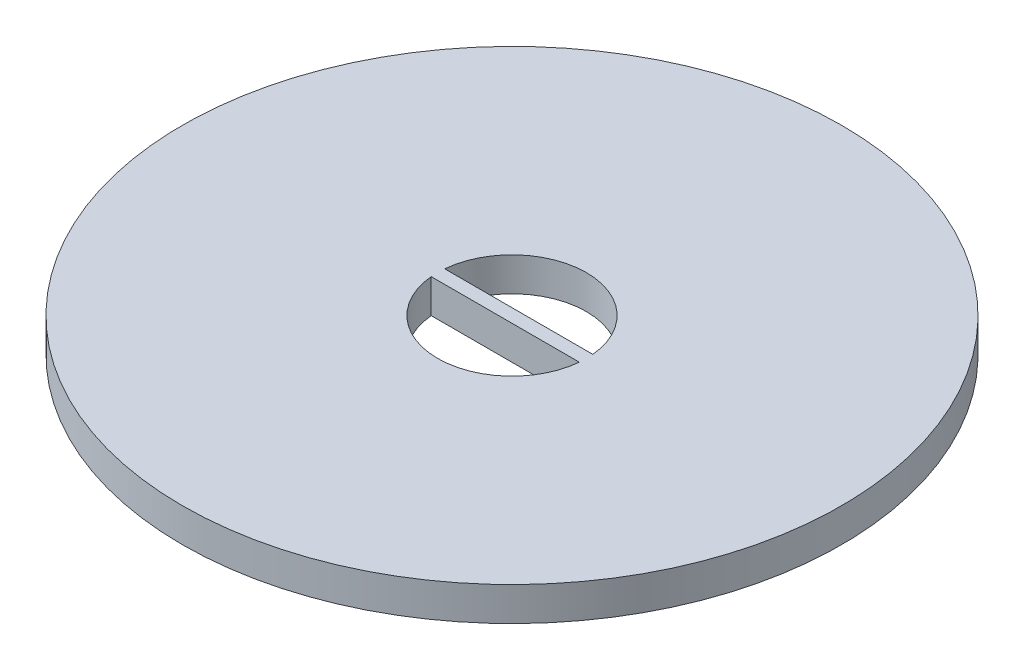
ISO-10303-21;
HEADER;
FILE_DESCRIPTION(('STEP AP214'),'2;1');
FILE_NAME('part.step','',(''),(''),'','','');
FILE_SCHEMA(('AUTOMOTIVE_DESIGN { 1 0 10303 214 1 1 1 1 }'));
ENDSEC;
DATA;
#1=APPLICATION_CONTEXT('core data for automotive mechanical design processes');
#2=APPLICATION_PROTOCOL_DEFINITION('international standard','automotive_design',2000,#1);
#3=PRODUCT_CONTEXT('',#1,'mechanical');
#4=PRODUCT('Part','Part','',(#3));
#5=PRODUCT_RELATED_PRODUCT_CATEGORY('part','',(#4));
#6=PRODUCT_DEFINITION_FORMATION('','',#4);
#7=PRODUCT_DEFINITION_CONTEXT('part definition',#1,'design');
#8=PRODUCT_DEFINITION('design','',#6,#7);
#9=PRODUCT_DEFINITION_SHAPE('','',#8);
#10=(LENGTH_UNIT() NAMED_UNIT(*) SI_UNIT(.MILLI.,.METRE.));
#11=(NAMED_UNIT(*) PLANE_ANGLE_UNIT() SI_UNIT($,.RADIAN.));
#12=(NAMED_UNIT(*) SI_UNIT($,.STERADIAN.) SOLID_ANGLE_UNIT());
#13=UNCERTAINTY_MEASURE_WITH_UNIT(LENGTH_MEASURE(1.E-05),#10,'distance_accuracy_value','');
#14=(GEOMETRIC_REPRESENTATION_CONTEXT(3) GLOBAL_UNCERTAINTY_ASSIGNED_CONTEXT((#13)) GLOBAL_UNIT_ASSIGNED_CONTEXT((#10,
#11,#12)) REPRESENTATION_CONTEXT('',''));
#15=CARTESIAN_POINT('',(0.,0.,0.));
#16=DIRECTION('',(0.,0.,1.));
#17=DIRECTION('',(1.,0.,0.));
#18=AXIS2_PLACEMENT_3D('',#15,#16,#17);
#19=CARTESIAN_POINT('',(0.,1.,0.));
#20=DIRECTION('',(0.,1.,0.));
#21=DIRECTION('',(0.,0.,1.));
#22=AXIS2_PLACEMENT_3D('',#19,#20,#21);
#23=PLANE('',#22);
#24=DIRECTION('',(1.,0.,0.));
#25=VECTOR('',#24,1.);
#26=CARTESIAN_POINT('',(0.,1.,-0.2));
#27=LINE('',#26,#25);
#28=CARTESIAN_POINT('',(-2.19089023002066,1.,-0.2));
#29=VERTEX_POINT('',#28);
#30=CARTESIAN_POINT('',(2.19089023002066,1.,-0.2));
#31=VERTEX_POINT('',#30);
#32=EDGE_CURVE('E61',#29,#31,#27,.T.);
#33=ORIENTED_EDGE('',*,*,#32,.F.);
#34=CARTESIAN_POINT('',(0.,1.,0.));
#35=DIRECTION('',(0.,1.,0.));
#36=DIRECTION('',(0.,0.,1.));
#37=AXIS2_PLACEMENT_3D('',#34,#35,#36);
#38=CIRCLE('',#37,2.2);
#39=EDGE_CURVE('E97',#31,#29,#38,.T.);
#40=ORIENTED_EDGE('',*,*,#39,.F.);
#41=EDGE_LOOP('',(#33,#40));
#42=FACE_BOUND('',#41,.T.);
#43=CARTESIAN_POINT('',(0.,1.,0.));
#44=DIRECTION('',(0.,1.,0.));
#45=DIRECTION('',(0.,0.,1.));
#46=AXIS2_PLACEMENT_3D('',#43,#44,#45);
#47=CIRCLE('',#46,9.75);
#48=CARTESIAN_POINT('',(0.,1.,9.75));
#49=VERTEX_POINT('',#48);
#50=EDGE_CURVE('E120',#49,#49,#47,.T.);
#51=ORIENTED_EDGE('',*,*,#50,.T.);
#52=EDGE_LOOP('',(#51));
#53=FACE_BOUND('',#52,.T.);
#54=CARTESIAN_POINT('',(0.,1.,0.));
#55=DIRECTION('',(0.,1.,0.));
#56=DIRECTION('',(0.,0.,1.));
#57=AXIS2_PLACEMENT_3D('',#54,#55,#56);
#58=CIRCLE('',#57,2.2);
#59=CARTESIAN_POINT('',(-2.19089023002066,1.,0.2));
#60=VERTEX_POINT('',#59);
#61=CARTESIAN_POINT('',(2.19089023002066,1.,0.2));
#62=VERTEX_POINT('',#61);
#63=EDGE_CURVE('E114',#60,#62,#58,.T.);
#64=ORIENTED_EDGE('',*,*,#63,.F.);
#65=DIRECTION('',(1.,0.,0.));
#66=VECTOR('',#65,1.);
#67=CARTESIAN_POINT('',(0.,1.,0.2));
#68=LINE('',#67,#66);
#69=EDGE_CURVE('E69',#60,#62,#68,.T.);
#70=ORIENTED_EDGE('',*,*,#69,.T.);
#71=EDGE_LOOP('',(#64,#70));
#72=FACE_BOUND('',#71,.T.);
#73=ADVANCED_FACE('F45',(#42,#53,#72),#23,.T.);
#74=CARTESIAN_POINT('',(0.,0.,0.));
#75=DIRECTION('',(0.,1.,0.));
#76=DIRECTION('',(0.,0.,1.));
#77=AXIS2_PLACEMENT_3D('',#74,#75,#76);
#78=PLANE('',#77);
#79=CARTESIAN_POINT('',(0.,0.,0.));
#80=DIRECTION('',(0.,1.,0.));
#81=DIRECTION('',(0.,0.,1.));
#82=AXIS2_PLACEMENT_3D('',#79,#80,#81);
#83=CIRCLE('',#82,2.2);
#84=CARTESIAN_POINT('',(2.19089023002066,0.,-0.2));
#85=VERTEX_POINT('',#84);
#86=CARTESIAN_POINT('',(-2.19089023002066,0.,-0.2));
#87=VERTEX_POINT('',#86);
#88=EDGE_CURVE('E54',#85,#87,#83,.T.);
#89=ORIENTED_EDGE('',*,*,#88,.T.);
#90=DIRECTION('',(1.,0.,0.));
#91=VECTOR('',#90,1.);
#92=CARTESIAN_POINT('',(0.,0.,-0.2));
#93=LINE('',#92,#91);
#94=EDGE_CURVE('E11',#87,#85,#93,.T.);
#95=ORIENTED_EDGE('',*,*,#94,.T.);
#96=EDGE_LOOP('',(#89,#95));
#97=FACE_BOUND('',#96,.T.);
#98=CARTESIAN_POINT('',(0.,0.,0.));
#99=DIRECTION('',(0.,1.,0.));
#100=DIRECTION('',(0.,0.,1.));
#101=AXIS2_PLACEMENT_3D('',#98,#99,#100);
#102=CIRCLE('',#101,9.75);
#103=CARTESIAN_POINT('',(0.,0.,9.75));
#104=VERTEX_POINT('',#103);
#105=EDGE_CURVE('E93',#104,#104,#102,.T.);
#106=ORIENTED_EDGE('',*,*,#105,.F.);
#107=EDGE_LOOP('',(#106));
#108=FACE_BOUND('',#107,.T.);
#109=DIRECTION('',(1.,0.,0.));
#110=VECTOR('',#109,1.);
#111=CARTESIAN_POINT('',(0.,0.,0.2));
#112=LINE('',#111,#110);
#113=CARTESIAN_POINT('',(-2.19089023002066,0.,0.2));
#114=VERTEX_POINT('',#113);
#115=CARTESIAN_POINT('',(2.19089023002066,0.,0.2));
#116=VERTEX_POINT('',#115);
#117=EDGE_CURVE('E131',#114,#116,#112,.T.);
#118=ORIENTED_EDGE('',*,*,#117,.F.);
#119=CARTESIAN_POINT('',(0.,0.,0.));
#120=DIRECTION('',(0.,1.,0.));
#121=DIRECTION('',(0.,0.,1.));
#122=AXIS2_PLACEMENT_3D('',#119,#120,#121);
#123=CIRCLE('',#122,2.2);
#124=EDGE_CURVE('E124',#114,#116,#123,.T.);
#125=ORIENTED_EDGE('',*,*,#124,.T.);
#126=EDGE_LOOP('',(#118,#125));
#127=FACE_BOUND('',#126,.T.);
#128=ADVANCED_FACE('F136',(#97,#108,#127),#78,.F.);
#129=CARTESIAN_POINT('',(0.,1.,0.));
#130=DIRECTION('',(0.,-1.,0.));
#131=DIRECTION('',(0.,0.,-1.));
#132=AXIS2_PLACEMENT_3D('',#129,#130,#131);
#133=CYLINDRICAL_SURFACE('',#132,9.75);
#134=ORIENTED_EDGE('',*,*,#50,.F.);
#135=EDGE_LOOP('',(#134));
#136=FACE_BOUND('',#135,.T.);
#137=ORIENTED_EDGE('',*,*,#105,.T.);
#138=EDGE_LOOP('',(#137));
#139=FACE_BOUND('',#138,.T.);
#140=ADVANCED_FACE('F47',(#136,#139),#133,.T.);
#141=CARTESIAN_POINT('',(0.,-2.,0.2));
#142=DIRECTION('',(0.,0.,1.));
#143=DIRECTION('',(1.,0.,0.));
#144=AXIS2_PLACEMENT_3D('',#141,#142,#143);
#145=PLANE('',#144);
#146=ORIENTED_EDGE('',*,*,#117,.T.);
#147=DIRECTION('',(0.,1.,0.));
#148=VECTOR('',#147,1.);
#149=CARTESIAN_POINT('',(2.19089023002066,-2.,0.2));
#150=LINE('',#149,#148);
#151=EDGE_CURVE('E104',#116,#62,#150,.T.);
#152=ORIENTED_EDGE('',*,*,#151,.T.);
#153=ORIENTED_EDGE('',*,*,#69,.F.);
#154=DIRECTION('',(0.,1.,0.));
#155=VECTOR('',#154,1.);
#156=CARTESIAN_POINT('',(-2.19089023002066,-2.,0.2));
#157=LINE('',#156,#155);
#158=EDGE_CURVE('E107',#114,#60,#157,.T.);
#159=ORIENTED_EDGE('',*,*,#158,.F.);
#160=EDGE_LOOP('',(#146,#152,#153,#159));
#161=FACE_BOUND('',#160,.T.);
#162=ADVANCED_FACE('F142',(#161),#145,.T.);
#163=CARTESIAN_POINT('',(0.,-2.,0.));
#164=DIRECTION('',(0.,1.,0.));
#165=DIRECTION('',(0.,0.,1.));
#166=AXIS2_PLACEMENT_3D('',#163,#164,#165);
#167=CYLINDRICAL_SURFACE('',#166,2.2);
#168=ORIENTED_EDGE('',*,*,#158,.T.);
#169=ORIENTED_EDGE('',*,*,#63,.T.);
#170=ORIENTED_EDGE('',*,*,#151,.F.);
#171=ORIENTED_EDGE('',*,*,#124,.F.);
#172=EDGE_LOOP('',(#168,#169,#170,#171));
#173=FACE_BOUND('',#172,.T.);
#174=ADVANCED_FACE('F145',(#173),#167,.F.);
#175=CARTESIAN_POINT('',(0.,-2.,-0.2));
#176=DIRECTION('',(0.,0.,1.));
#177=DIRECTION('',(1.,0.,0.));
#178=AXIS2_PLACEMENT_3D('',#175,#176,#177);
#179=PLANE('',#178);
#180=DIRECTION('',(0.,1.,0.));
#181=VECTOR('',#180,1.);
#182=CARTESIAN_POINT('',(-2.19089023002066,-2.,-0.2));
#183=LINE('',#182,#181);
#184=EDGE_CURVE('E87',#87,#29,#183,.T.);
#185=ORIENTED_EDGE('',*,*,#184,.T.);
#186=ORIENTED_EDGE('',*,*,#32,.T.);
#187=DIRECTION('',(0.,1.,0.));
#188=VECTOR('',#187,1.);
#189=CARTESIAN_POINT('',(2.19089023002066,-2.,-0.2));
#190=LINE('',#189,#188);
#191=EDGE_CURVE('E94',#85,#31,#190,.T.);
#192=ORIENTED_EDGE('',*,*,#191,.F.);
#193=ORIENTED_EDGE('',*,*,#94,.F.);
#194=EDGE_LOOP('',(#185,#186,#192,#193));
#195=FACE_BOUND('',#194,.T.);
#196=ADVANCED_FACE('F89',(#195),#179,.F.);
#197=CARTESIAN_POINT('',(0.,-2.,0.));
#198=DIRECTION('',(0.,1.,0.));
#199=DIRECTION('',(0.,0.,1.));
#200=AXIS2_PLACEMENT_3D('',#197,#198,#199);
#201=CYLINDRICAL_SURFACE('',#200,2.2);
#202=ORIENTED_EDGE('',*,*,#191,.T.);
#203=ORIENTED_EDGE('',*,*,#39,.T.);
#204=ORIENTED_EDGE('',*,*,#184,.F.);
#205=ORIENTED_EDGE('',*,*,#88,.F.);
#206=EDGE_LOOP('',(#202,#203,#204,#205));
#207=FACE_BOUND('',#206,.T.);
#208=ADVANCED_FACE('F98',(#207),#201,.F.);
#209=CLOSED_SHELL('',(#73,#128,#140,#162,#174,#196,#208));
#210=MANIFOLD_SOLID_BREP('B2',#209);
#211=ADVANCED_BREP_SHAPE_REPRESENTATION('',(#18,#210),#14);
#212=SHAPE_DEFINITION_REPRESENTATION(#9,#211);
ENDSEC;
END-ISO-10303-21;
